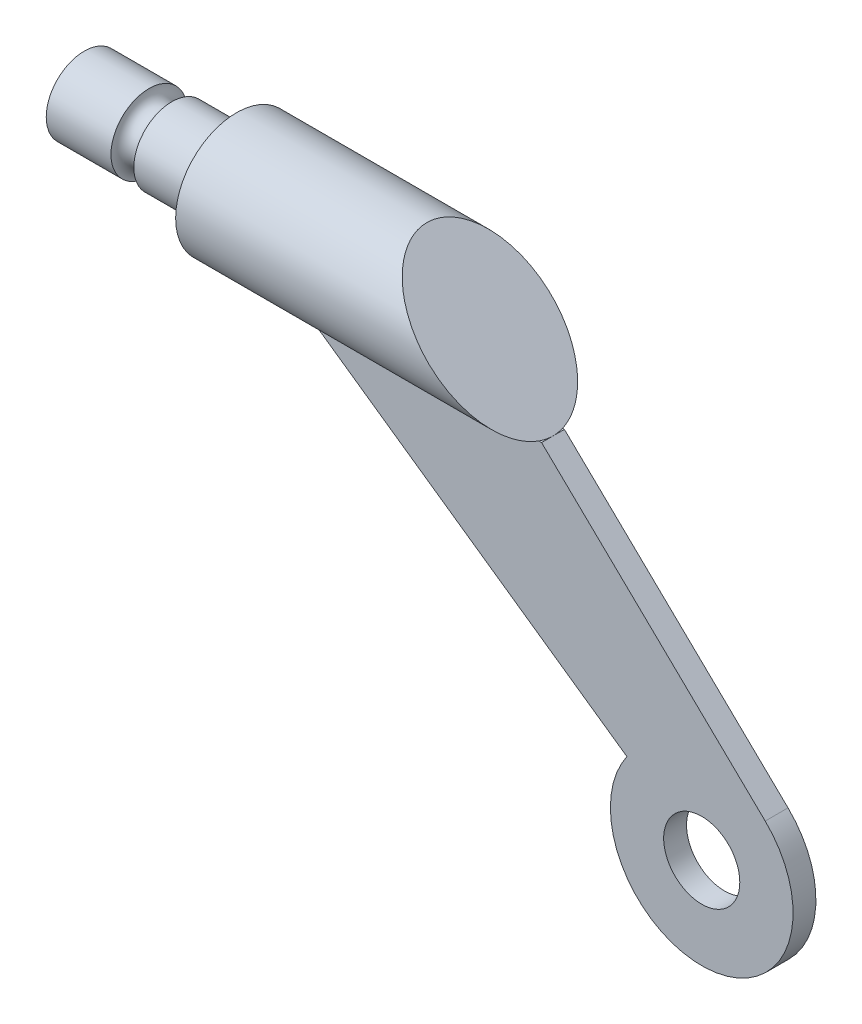
ISO-10303-21;
HEADER;
FILE_DESCRIPTION(('STEP AP214'),'2;1');
FILE_NAME('part.step','',(''),(''),'','','');
FILE_SCHEMA(('AUTOMOTIVE_DESIGN { 1 0 10303 214 1 1 1 1 }'));
ENDSEC;
DATA;
#1=APPLICATION_CONTEXT('core data for automotive mechanical design processes');
#2=APPLICATION_PROTOCOL_DEFINITION('international standard','automotive_design',2000,#1);
#3=PRODUCT_CONTEXT('',#1,'mechanical');
#4=PRODUCT('Part','Part','',(#3));
#5=PRODUCT_RELATED_PRODUCT_CATEGORY('part','',(#4));
#6=PRODUCT_DEFINITION_FORMATION('','',#4);
#7=PRODUCT_DEFINITION_CONTEXT('part definition',#1,'design');
#8=PRODUCT_DEFINITION('design','',#6,#7);
#9=PRODUCT_DEFINITION_SHAPE('','',#8);
#10=(LENGTH_UNIT() NAMED_UNIT(*) SI_UNIT(.MILLI.,.METRE.));
#11=(NAMED_UNIT(*) PLANE_ANGLE_UNIT() SI_UNIT($,.RADIAN.));
#12=(NAMED_UNIT(*) SI_UNIT($,.STERADIAN.) SOLID_ANGLE_UNIT());
#13=UNCERTAINTY_MEASURE_WITH_UNIT(LENGTH_MEASURE(1.E-05),#10,'distance_accuracy_value','');
#14=(GEOMETRIC_REPRESENTATION_CONTEXT(3) GLOBAL_UNCERTAINTY_ASSIGNED_CONTEXT((#13)) GLOBAL_UNIT_ASSIGNED_CONTEXT((#10,
#11,#12)) REPRESENTATION_CONTEXT('',''));
#15=CARTESIAN_POINT('',(0.,0.,0.));
#16=DIRECTION('',(0.,0.,1.));
#17=DIRECTION('',(1.,0.,0.));
#18=AXIS2_PLACEMENT_3D('',#15,#16,#17);
#19=CARTESIAN_POINT('',(0.,0.,1.5));
#20=DIRECTION('',(0.573576436351047,0.819152044288991,0.));
#21=DIRECTION('',(-0.819152044288991,0.573576436351047,0.));
#22=AXIS2_PLACEMENT_3D('',#19,#20,#21);
#23=PLANE('',#22);
#24=DIRECTION('',(0.819152044288991,-0.573576436351047,0.));
#25=VECTOR('',#24,1.);
#26=CARTESIAN_POINT('',(0.,0.,-1.5));
#27=LINE('',#26,#25);
#28=CARTESIAN_POINT('',(-52.8414762494581,37.,-1.5));
#29=VERTEX_POINT('',#28);
#30=CARTESIAN_POINT('',(-9.82982453146789,6.88291723621257,-1.5));
#31=VERTEX_POINT('',#30);
#32=EDGE_CURVE('E120',#29,#31,#27,.T.);
#33=ORIENTED_EDGE('',*,*,#32,.T.);
#34=DIRECTION('',(0.,0.,-1.));
#35=VECTOR('',#34,1.);
#36=CARTESIAN_POINT('',(-9.82982453146789,6.88291723621257,1.5));
#37=LINE('',#36,#35);
#38=CARTESIAN_POINT('',(-9.82982453146789,6.88291723621257,1.5));
#39=VERTEX_POINT('',#38);
#40=EDGE_CURVE('E12',#39,#31,#37,.T.);
#41=ORIENTED_EDGE('',*,*,#40,.F.);
#42=DIRECTION('',(0.819152044288991,-0.573576436351047,0.));
#43=VECTOR('',#42,1.);
#44=CARTESIAN_POINT('',(0.,0.,1.5));
#45=LINE('',#44,#43);
#46=CARTESIAN_POINT('',(-52.8414762494581,37.,1.5));
#47=VERTEX_POINT('',#46);
#48=EDGE_CURVE('E103',#47,#39,#45,.T.);
#49=ORIENTED_EDGE('',*,*,#48,.F.);
#50=DIRECTION('',(0.,0.,-1.));
#51=VECTOR('',#50,1.);
#52=CARTESIAN_POINT('',(-52.8414762494581,37.,1.5));
#53=LINE('',#52,#51);
#54=EDGE_CURVE('E69',#47,#29,#53,.T.);
#55=ORIENTED_EDGE('',*,*,#54,.T.);
#56=EDGE_LOOP('',(#33,#41,#49,#55));
#57=FACE_BOUND('',#56,.T.);
#58=ADVANCED_FACE('F53',(#57),#23,.F.);
#59=CARTESIAN_POINT('',(0.,0.,1.5));
#60=DIRECTION('',(0.,0.,-1.));
#61=DIRECTION('',(-1.,0.,0.));
#62=AXIS2_PLACEMENT_3D('',#59,#60,#61);
#63=CYLINDRICAL_SURFACE('',#62,12.);
#64=CARTESIAN_POINT('',(0.,0.,-1.5));
#65=DIRECTION('',(0.,0.,1.));
#66=DIRECTION('',(1.,0.,0.));
#67=AXIS2_PLACEMENT_3D('',#64,#65,#66);
#68=CIRCLE('',#67,12.);
#69=CARTESIAN_POINT('',(8.33590044550798,8.63207760406379,-1.5));
#70=VERTEX_POINT('',#69);
#71=EDGE_CURVE('E108',#31,#70,#68,.T.);
#72=ORIENTED_EDGE('',*,*,#71,.T.);
#73=DIRECTION('',(0.,0.,-1.));
#74=VECTOR('',#73,1.);
#75=CARTESIAN_POINT('',(8.33590044550798,8.63207760406379,1.5));
#76=LINE('',#75,#74);
#77=CARTESIAN_POINT('',(8.33590044550798,8.63207760406379,1.5));
#78=VERTEX_POINT('',#77);
#79=EDGE_CURVE('E61',#78,#70,#76,.T.);
#80=ORIENTED_EDGE('',*,*,#79,.F.);
#81=CARTESIAN_POINT('',(0.,0.,1.5));
#82=DIRECTION('',(0.,0.,1.));
#83=DIRECTION('',(1.,0.,0.));
#84=AXIS2_PLACEMENT_3D('',#81,#82,#83);
#85=CIRCLE('',#84,12.);
#86=EDGE_CURVE('E94',#39,#78,#85,.T.);
#87=ORIENTED_EDGE('',*,*,#86,.F.);
#88=ORIENTED_EDGE('',*,*,#40,.T.);
#89=EDGE_LOOP('',(#72,#80,#87,#88));
#90=FACE_BOUND('',#89,.T.);
#91=ADVANCED_FACE('F107',(#90),#63,.T.);
#92=CARTESIAN_POINT('',(8.33590044550798,8.63207760406379,1.5));
#93=DIRECTION('',(0.694658370458999,0.71933980033865,0.));
#94=DIRECTION('',(-0.71933980033865,0.694658370458999,0.));
#95=AXIS2_PLACEMENT_3D('',#92,#93,#94);
#96=PLANE('',#95);
#97=DIRECTION('',(0.71933980033865,-0.694658370458999,0.));
#98=VECTOR('',#97,1.);
#99=CARTESIAN_POINT('',(8.33590044550798,8.63207760406379,-1.5));
#100=LINE('',#99,#98);
#101=CARTESIAN_POINT('',(-21.0399431347422,37.,-1.5));
#102=VERTEX_POINT('',#101);
#103=EDGE_CURVE('E123',#102,#70,#100,.T.);
#104=ORIENTED_EDGE('',*,*,#103,.F.);
#105=DIRECTION('',(0.,0.,-1.));
#106=VECTOR('',#105,1.);
#107=CARTESIAN_POINT('',(-21.0399431347422,37.,1.5));
#108=LINE('',#107,#106);
#109=CARTESIAN_POINT('',(-21.0399431347422,37.,1.5));
#110=VERTEX_POINT('',#109);
#111=EDGE_CURVE('E83',#110,#102,#108,.T.);
#112=ORIENTED_EDGE('',*,*,#111,.F.);
#113=DIRECTION('',(0.71933980033865,-0.694658370458999,0.));
#114=VECTOR('',#113,1.);
#115=CARTESIAN_POINT('',(8.33590044550798,8.63207760406379,1.5));
#116=LINE('',#115,#114);
#117=EDGE_CURVE('E102',#110,#78,#116,.T.);
#118=ORIENTED_EDGE('',*,*,#117,.T.);
#119=ORIENTED_EDGE('',*,*,#79,.T.);
#120=EDGE_LOOP('',(#104,#112,#118,#119));
#121=FACE_BOUND('',#120,.T.);
#122=ADVANCED_FACE('F111',(#121),#96,.T.);
#123=CARTESIAN_POINT('',(0.,37.,1.5));
#124=DIRECTION('',(0.,1.,0.));
#125=DIRECTION('',(0.,0.,1.));
#126=AXIS2_PLACEMENT_3D('',#123,#124,#125);
#127=PLANE('',#126);
#128=DIRECTION('',(1.,0.,0.));
#129=VECTOR('',#128,1.);
#130=CARTESIAN_POINT('',(0.,37.,-1.5));
#131=LINE('',#130,#129);
#132=EDGE_CURVE('E125',#29,#102,#131,.T.);
#133=ORIENTED_EDGE('',*,*,#132,.F.);
#134=ORIENTED_EDGE('',*,*,#54,.F.);
#135=DIRECTION('',(1.,0.,0.));
#136=VECTOR('',#135,1.);
#137=CARTESIAN_POINT('',(0.,37.,1.5));
#138=LINE('',#137,#136);
#139=EDGE_CURVE('E112',#47,#110,#138,.T.);
#140=ORIENTED_EDGE('',*,*,#139,.T.);
#141=ORIENTED_EDGE('',*,*,#111,.T.);
#142=EDGE_LOOP('',(#133,#134,#140,#141));
#143=FACE_BOUND('',#142,.T.);
#144=ADVANCED_FACE('F138',(#143),#127,.T.);
#145=CARTESIAN_POINT('',(0.,0.,1.5));
#146=DIRECTION('',(0.,0.,-1.));
#147=DIRECTION('',(-1.,0.,0.));
#148=AXIS2_PLACEMENT_3D('',#145,#146,#147);
#149=CYLINDRICAL_SURFACE('',#148,5.);
#150=CARTESIAN_POINT('',(0.,0.,1.5));
#151=DIRECTION('',(0.,0.,1.));
#152=DIRECTION('',(1.,0.,0.));
#153=AXIS2_PLACEMENT_3D('',#150,#151,#152);
#154=CIRCLE('',#153,5.);
#155=CARTESIAN_POINT('',(5.,0.,1.5));
#156=VERTEX_POINT('',#155);
#157=EDGE_CURVE('E114',#156,#156,#154,.T.);
#158=ORIENTED_EDGE('',*,*,#157,.T.);
#159=EDGE_LOOP('',(#158));
#160=FACE_BOUND('',#159,.T.);
#161=CARTESIAN_POINT('',(0.,0.,-1.5));
#162=DIRECTION('',(0.,0.,1.));
#163=DIRECTION('',(1.,0.,0.));
#164=AXIS2_PLACEMENT_3D('',#161,#162,#163);
#165=CIRCLE('',#164,5.);
#166=CARTESIAN_POINT('',(5.,0.,-1.5));
#167=VERTEX_POINT('',#166);
#168=EDGE_CURVE('E128',#167,#167,#165,.T.);
#169=ORIENTED_EDGE('',*,*,#168,.F.);
#170=EDGE_LOOP('',(#169));
#171=FACE_BOUND('',#170,.T.);
#172=ADVANCED_FACE('F136',(#160,#171),#149,.F.);
#173=CARTESIAN_POINT('',(0.,0.,1.5));
#174=DIRECTION('',(0.,0.,1.));
#175=DIRECTION('',(1.,0.,0.));
#176=AXIS2_PLACEMENT_3D('',#173,#174,#175);
#177=PLANE('',#176);
#178=ORIENTED_EDGE('',*,*,#48,.T.);
#179=ORIENTED_EDGE('',*,*,#86,.T.);
#180=ORIENTED_EDGE('',*,*,#117,.F.);
#181=ORIENTED_EDGE('',*,*,#139,.F.);
#182=EDGE_LOOP('',(#178,#179,#180,#181));
#183=FACE_BOUND('',#182,.T.);
#184=ORIENTED_EDGE('',*,*,#157,.F.);
#185=EDGE_LOOP('',(#184));
#186=FACE_BOUND('',#185,.T.);
#187=ADVANCED_FACE('F98',(#183,#186),#177,.T.);
#188=CARTESIAN_POINT('',(0.,0.,-1.5));
#189=DIRECTION('',(0.,0.,1.));
#190=DIRECTION('',(1.,0.,0.));
#191=AXIS2_PLACEMENT_3D('',#188,#189,#190);
#192=PLANE('',#191);
#193=ORIENTED_EDGE('',*,*,#32,.F.);
#194=ORIENTED_EDGE('',*,*,#132,.T.);
#195=ORIENTED_EDGE('',*,*,#103,.T.);
#196=ORIENTED_EDGE('',*,*,#71,.F.);
#197=EDGE_LOOP('',(#193,#194,#195,#196));
#198=FACE_BOUND('',#197,.T.);
#199=ORIENTED_EDGE('',*,*,#168,.T.);
#200=EDGE_LOOP('',(#199));
#201=FACE_BOUND('',#200,.T.);
#202=ADVANCED_FACE('F134',(#198,#201),#192,.F.);
#203=CLOSED_SHELL('',(#58,#91,#122,#144,#172,#187,#202));
#204=MANIFOLD_SOLID_BREP('B2',#203);
#205=CARTESIAN_POINT('',(-114.703915618861,45.,0.));
#206=DIRECTION('',(-1.,0.,0.));
#207=DIRECTION('',(0.,0.,1.));
#208=AXIS2_PLACEMENT_3D('',#205,#206,#207);
#209=CYLINDRICAL_SURFACE('',#208,8.);
#210=CARTESIAN_POINT('',(-62.6084281553913,45.,0.));
#211=DIRECTION('',(-1.,0.,0.));
#212=DIRECTION('',(0.,0.,1.));
#213=AXIS2_PLACEMENT_3D('',#210,#211,#212);
#214=CIRCLE('',#213,8.);
#215=CARTESIAN_POINT('',(-62.6084281553913,45.,8.));
#216=VERTEX_POINT('',#215);
#217=EDGE_CURVE('E239',#216,#216,#214,.T.);
#218=ORIENTED_EDGE('',*,*,#217,.F.);
#219=EDGE_LOOP('',(#218));
#220=FACE_BOUND('',#219,.T.);
#221=CARTESIAN_POINT('',(-29.3241856450668,45.,0.));
#222=DIRECTION('',(0.694658370458999,0.71933980033865,0.));
#223=DIRECTION('',(-0.71933980033865,0.694658370458999,0.));
#224=AXIS2_PLACEMENT_3D('',#221,#222,#223);
#225=ELLIPSE('',#224,11.5164523170058,8.);
#226=CARTESIAN_POINT('',(-37.6084281553913,53.,0.));
#227=VERTEX_POINT('',#226);
#228=EDGE_CURVE('E208',#227,#227,#225,.F.);
#229=ORIENTED_EDGE('',*,*,#228,.T.);
#230=EDGE_LOOP('',(#229));
#231=FACE_BOUND('',#230,.T.);
#232=ADVANCED_FACE('F204',(#220,#231),#209,.T.);
#233=CARTESIAN_POINT('',(-114.703915618861,45.,0.));
#234=DIRECTION('',(-1.,0.,0.));
#235=DIRECTION('',(0.,0.,1.));
#236=AXIS2_PLACEMENT_3D('',#233,#234,#235);
#237=CYLINDRICAL_SURFACE('',#236,5.);
#238=CARTESIAN_POINT('',(-62.6084281553913,45.,0.));
#239=DIRECTION('',(-1.,0.,0.));
#240=DIRECTION('',(0.,0.,1.));
#241=AXIS2_PLACEMENT_3D('',#238,#239,#240);
#242=CIRCLE('',#241,5.);
#243=CARTESIAN_POINT('',(-62.6084281553913,45.,5.));
#244=VERTEX_POINT('',#243);
#245=EDGE_CURVE('E232',#244,#244,#242,.T.);
#246=ORIENTED_EDGE('',*,*,#245,.T.);
#247=EDGE_LOOP('',(#246));
#248=FACE_BOUND('',#247,.T.);
#249=CARTESIAN_POINT('',(-71.1034860121398,45.,0.));
#250=DIRECTION('',(-1.,0.,0.));
#251=DIRECTION('',(0.,0.,1.));
#252=AXIS2_PLACEMENT_3D('',#249,#250,#251);
#253=CIRCLE('',#252,5.);
#254=CARTESIAN_POINT('',(-71.1034860121398,45.,5.));
#255=VERTEX_POINT('',#254);
#256=EDGE_CURVE('E51',#255,#255,#253,.T.);
#257=ORIENTED_EDGE('',*,*,#256,.F.);
#258=EDGE_LOOP('',(#257));
#259=FACE_BOUND('',#258,.T.);
#260=ADVANCED_FACE('F206',(#248,#259),#237,.T.);
#261=CARTESIAN_POINT('',(-72.6034860121398,45.,0.));
#262=DIRECTION('',(-1.,0.,0.));
#263=DIRECTION('',(0.,0.,1.));
#264=AXIS2_PLACEMENT_3D('',#261,#262,#263);
#265=TOROIDAL_SURFACE('',#264,5.,1.5);
#266=ORIENTED_EDGE('',*,*,#256,.T.);
#267=EDGE_LOOP('',(#266));
#268=FACE_BOUND('',#267,.T.);
#269=CARTESIAN_POINT('',(-74.1034860121398,45.,0.));
#270=DIRECTION('',(-1.,0.,0.));
#271=DIRECTION('',(0.,0.,1.));
#272=AXIS2_PLACEMENT_3D('',#269,#270,#271);
#273=CIRCLE('',#272,5.);
#274=CARTESIAN_POINT('',(-74.1034860121398,45.,5.));
#275=VERTEX_POINT('',#274);
#276=EDGE_CURVE('E213',#275,#275,#273,.T.);
#277=ORIENTED_EDGE('',*,*,#276,.F.);
#278=EDGE_LOOP('',(#277));
#279=FACE_BOUND('',#278,.T.);
#280=ADVANCED_FACE('F254',(#268,#279),#265,.F.);
#281=CARTESIAN_POINT('',(-114.703915618861,45.,0.));
#282=DIRECTION('',(-1.,0.,0.));
#283=DIRECTION('',(0.,0.,1.));
#284=AXIS2_PLACEMENT_3D('',#281,#282,#283);
#285=CYLINDRICAL_SURFACE('',#284,5.);
#286=ORIENTED_EDGE('',*,*,#276,.T.);
#287=EDGE_LOOP('',(#286));
#288=FACE_BOUND('',#287,.T.);
#289=CARTESIAN_POINT('',(-82.6084281553913,45.,0.));
#290=DIRECTION('',(-1.,0.,0.));
#291=DIRECTION('',(0.,0.,1.));
#292=AXIS2_PLACEMENT_3D('',#289,#290,#291);
#293=CIRCLE('',#292,5.);
#294=CARTESIAN_POINT('',(-82.6084281553913,45.,5.));
#295=VERTEX_POINT('',#294);
#296=EDGE_CURVE('E243',#295,#295,#293,.T.);
#297=ORIENTED_EDGE('',*,*,#296,.F.);
#298=EDGE_LOOP('',(#297));
#299=FACE_BOUND('',#298,.T.);
#300=ADVANCED_FACE('F251',(#288,#299),#285,.T.);
#301=CARTESIAN_POINT('',(-82.6084281553913,45.,0.));
#302=DIRECTION('',(-1.,0.,0.));
#303=DIRECTION('',(0.,0.,1.));
#304=AXIS2_PLACEMENT_3D('',#301,#302,#303);
#305=PLANE('',#304);
#306=CARTESIAN_POINT('',(-82.6084281553913,45.,0.));
#307=DIRECTION('',(-1.,0.,0.));
#308=DIRECTION('',(0.,0.,1.));
#309=AXIS2_PLACEMENT_3D('',#306,#307,#308);
#310=CIRCLE('',#309,2.49999999999999);
#311=CARTESIAN_POINT('',(-82.6084281553913,45.,2.49999999999999));
#312=VERTEX_POINT('',#311);
#313=EDGE_CURVE('E227',#312,#312,#310,.T.);
#314=ORIENTED_EDGE('',*,*,#313,.F.);
#315=EDGE_LOOP('',(#314));
#316=FACE_BOUND('',#315,.T.);
#317=ORIENTED_EDGE('',*,*,#296,.T.);
#318=EDGE_LOOP('',(#317));
#319=FACE_BOUND('',#318,.T.);
#320=ADVANCED_FACE('F261',(#316,#319),#305,.T.);
#321=CARTESIAN_POINT('',(-62.6084281553913,50.,0.));
#322=DIRECTION('',(-1.,0.,0.));
#323=DIRECTION('',(0.,0.,1.));
#324=AXIS2_PLACEMENT_3D('',#321,#322,#323);
#325=PLANE('',#324);
#326=ORIENTED_EDGE('',*,*,#217,.T.);
#327=EDGE_LOOP('',(#326));
#328=FACE_BOUND('',#327,.T.);
#329=ORIENTED_EDGE('',*,*,#245,.F.);
#330=EDGE_LOOP('',(#329));
#331=FACE_BOUND('',#330,.T.);
#332=ADVANCED_FACE('F273',(#328,#331),#325,.T.);
#333=CARTESIAN_POINT('',(-37.6084281553913,53.,88.4411307305602));
#334=DIRECTION('',(0.694658370458999,0.71933980033865,0.));
#335=DIRECTION('',(-0.71933980033865,0.694658370458999,0.));
#336=AXIS2_PLACEMENT_3D('',#333,#334,#335);
#337=PLANE('',#336);
#338=ORIENTED_EDGE('',*,*,#228,.F.);
#339=EDGE_LOOP('',(#338));
#340=FACE_BOUND('',#339,.T.);
#341=ADVANCED_FACE('F220',(#340),#337,.T.);
#342=CARTESIAN_POINT('',(-40.1084281553913,45.,0.));
#343=DIRECTION('',(-1.,0.,0.));
#344=DIRECTION('',(0.,0.,1.));
#345=AXIS2_PLACEMENT_3D('',#342,#343,#344);
#346=CONICAL_SURFACE('',#345,2.49999999999999,0.785398163397444);
#347=CARTESIAN_POINT('',(-37.6084281553913,45.,0.));
#348=VERTEX_POINT('',#347);
#349=VERTEX_LOOP('',#348);
#350=FACE_BOUND('',#349,.T.);
#351=CARTESIAN_POINT('',(-40.1084281553913,45.,0.));
#352=DIRECTION('',(-1.,0.,0.));
#353=DIRECTION('',(0.,0.,1.));
#354=AXIS2_PLACEMENT_3D('',#351,#352,#353);
#355=CIRCLE('',#354,2.49999999999999);
#356=CARTESIAN_POINT('',(-40.1084281553913,45.,2.49999999999999));
#357=VERTEX_POINT('',#356);
#358=EDGE_CURVE('E224',#357,#357,#355,.T.);
#359=ORIENTED_EDGE('',*,*,#358,.T.);
#360=EDGE_LOOP('',(#359));
#361=FACE_BOUND('',#360,.T.);
#362=ADVANCED_FACE('F216',(#350,#361),#346,.F.);
#363=CARTESIAN_POINT('',(-82.6084281553913,45.,0.));
#364=DIRECTION('',(-1.,0.,0.));
#365=DIRECTION('',(0.,0.,1.));
#366=AXIS2_PLACEMENT_3D('',#363,#364,#365);
#367=CYLINDRICAL_SURFACE('',#366,2.49999999999999);
#368=ORIENTED_EDGE('',*,*,#358,.F.);
#369=EDGE_LOOP('',(#368));
#370=FACE_BOUND('',#369,.T.);
#371=ORIENTED_EDGE('',*,*,#313,.T.);
#372=EDGE_LOOP('',(#371));
#373=FACE_BOUND('',#372,.T.);
#374=ADVANCED_FACE('F219',(#370,#373),#367,.F.);
#375=CLOSED_SHELL('',(#232,#260,#280,#300,#320,#332,#341,#362,#374));
#376=MANIFOLD_SOLID_BREP('B6',#375);
#377=ADVANCED_BREP_SHAPE_REPRESENTATION('',(#18,#204,#376),#14);
#378=SHAPE_DEFINITION_REPRESENTATION(#9,#377);
ENDSEC;
END-ISO-10303-21;
